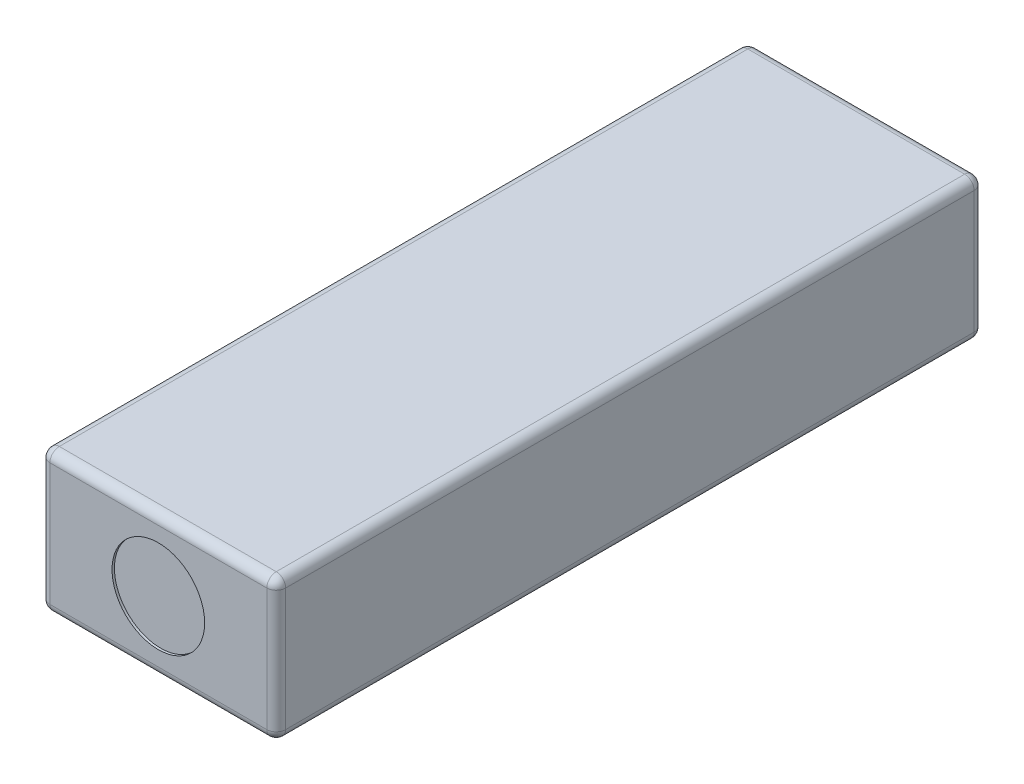
ISO-10303-21;
HEADER;
FILE_DESCRIPTION(('STEP AP214'),'2;1');
FILE_NAME('part.step','',(''),(''),'','','');
FILE_SCHEMA(('AUTOMOTIVE_DESIGN { 1 0 10303 214 1 1 1 1 }'));
ENDSEC;
DATA;
#1=APPLICATION_CONTEXT('core data for automotive mechanical design processes');
#2=APPLICATION_PROTOCOL_DEFINITION('international standard','automotive_design',2000,#1);
#3=PRODUCT_CONTEXT('',#1,'mechanical');
#4=PRODUCT('Part','Part','',(#3));
#5=PRODUCT_RELATED_PRODUCT_CATEGORY('part','',(#4));
#6=PRODUCT_DEFINITION_FORMATION('','',#4);
#7=PRODUCT_DEFINITION_CONTEXT('part definition',#1,'design');
#8=PRODUCT_DEFINITION('design','',#6,#7);
#9=PRODUCT_DEFINITION_SHAPE('','',#8);
#10=(LENGTH_UNIT() NAMED_UNIT(*) SI_UNIT(.MILLI.,.METRE.));
#11=(NAMED_UNIT(*) PLANE_ANGLE_UNIT() SI_UNIT($,.RADIAN.));
#12=(NAMED_UNIT(*) SI_UNIT($,.STERADIAN.) SOLID_ANGLE_UNIT());
#13=UNCERTAINTY_MEASURE_WITH_UNIT(LENGTH_MEASURE(1.E-05),#10,'distance_accuracy_value','');
#14=(GEOMETRIC_REPRESENTATION_CONTEXT(3) GLOBAL_UNCERTAINTY_ASSIGNED_CONTEXT((#13)) GLOBAL_UNIT_ASSIGNED_CONTEXT((#10,
#11,#12)) REPRESENTATION_CONTEXT('',''));
#15=CARTESIAN_POINT('',(0.,0.,0.));
#16=DIRECTION('',(0.,0.,1.));
#17=DIRECTION('',(1.,0.,0.));
#18=AXIS2_PLACEMENT_3D('',#15,#16,#17);
#19=CARTESIAN_POINT('',(25.,30.,-75.));
#20=DIRECTION('',(-1.,0.,0.));
#21=DIRECTION('',(0.,0.,1.));
#22=AXIS2_PLACEMENT_3D('',#19,#20,#21);
#23=PLANE('',#22);
#24=DIRECTION('',(0.,-1.,0.));
#25=VECTOR('',#24,1.);
#26=CARTESIAN_POINT('',(25.,30.,73.));
#27=LINE('',#26,#25);
#28=CARTESIAN_POINT('',(25.,28.,73.));
#29=VERTEX_POINT('',#28);
#30=CARTESIAN_POINT('',(25.,2.,73.));
#31=VERTEX_POINT('',#30);
#32=EDGE_CURVE('E141',#29,#31,#27,.T.);
#33=ORIENTED_EDGE('',*,*,#32,.T.);
#34=DIRECTION('',(0.,0.,-1.));
#35=VECTOR('',#34,1.);
#36=CARTESIAN_POINT('',(25.,2.,-75.));
#37=LINE('',#36,#35);
#38=CARTESIAN_POINT('',(25.,2.,-73.));
#39=VERTEX_POINT('',#38);
#40=EDGE_CURVE('E136',#31,#39,#37,.T.);
#41=ORIENTED_EDGE('',*,*,#40,.T.);
#42=DIRECTION('',(0.,-1.,0.));
#43=VECTOR('',#42,1.);
#44=CARTESIAN_POINT('',(25.,30.,-73.));
#45=LINE('',#44,#43);
#46=CARTESIAN_POINT('',(25.,28.,-73.));
#47=VERTEX_POINT('',#46);
#48=EDGE_CURVE('E131',#39,#47,#45,.F.);
#49=ORIENTED_EDGE('',*,*,#48,.T.);
#50=DIRECTION('',(0.,0.,-1.));
#51=VECTOR('',#50,1.);
#52=CARTESIAN_POINT('',(25.,28.,75.));
#53=LINE('',#52,#51);
#54=EDGE_CURVE('E133',#47,#29,#53,.F.);
#55=ORIENTED_EDGE('',*,*,#54,.T.);
#56=EDGE_LOOP('',(#33,#41,#49,#55));
#57=FACE_BOUND('',#56,.T.);
#58=ADVANCED_FACE('F42',(#57),#23,.F.);
#59=CARTESIAN_POINT('',(-25.,30.,-75.));
#60=DIRECTION('',(0.,0.,1.));
#61=DIRECTION('',(1.,0.,0.));
#62=AXIS2_PLACEMENT_3D('',#59,#60,#61);
#63=PLANE('',#62);
#64=DIRECTION('',(-1.,0.,0.));
#65=VECTOR('',#64,1.);
#66=CARTESIAN_POINT('',(25.,28.,-75.));
#67=LINE('',#66,#65);
#68=CARTESIAN_POINT('',(-23.,28.,-75.));
#69=VERTEX_POINT('',#68);
#70=CARTESIAN_POINT('',(23.,28.,-75.));
#71=VERTEX_POINT('',#70);
#72=EDGE_CURVE('E266',#69,#71,#67,.F.);
#73=ORIENTED_EDGE('',*,*,#72,.T.);
#74=DIRECTION('',(0.,-1.,0.));
#75=VECTOR('',#74,1.);
#76=CARTESIAN_POINT('',(23.,30.,-75.));
#77=LINE('',#76,#75);
#78=CARTESIAN_POINT('',(23.,2.,-75.));
#79=VERTEX_POINT('',#78);
#80=EDGE_CURVE('E165',#71,#79,#77,.T.);
#81=ORIENTED_EDGE('',*,*,#80,.T.);
#82=DIRECTION('',(-1.,0.,0.));
#83=VECTOR('',#82,1.);
#84=CARTESIAN_POINT('',(-25.,2.,-75.));
#85=LINE('',#84,#83);
#86=CARTESIAN_POINT('',(-23.,2.,-75.));
#87=VERTEX_POINT('',#86);
#88=EDGE_CURVE('E269',#79,#87,#85,.T.);
#89=ORIENTED_EDGE('',*,*,#88,.T.);
#90=DIRECTION('',(0.,-1.,0.));
#91=VECTOR('',#90,1.);
#92=CARTESIAN_POINT('',(-23.,30.,-75.));
#93=LINE('',#92,#91);
#94=EDGE_CURVE('E263',#87,#69,#93,.F.);
#95=ORIENTED_EDGE('',*,*,#94,.T.);
#96=EDGE_LOOP('',(#73,#81,#89,#95));
#97=FACE_BOUND('',#96,.T.);
#98=ADVANCED_FACE('F341',(#97),#63,.F.);
#99=CARTESIAN_POINT('',(-25.,30.,-75.));
#100=DIRECTION('',(1.,0.,0.));
#101=DIRECTION('',(0.,0.,-1.));
#102=AXIS2_PLACEMENT_3D('',#99,#100,#101);
#103=PLANE('',#102);
#104=DIRECTION('',(0.,0.,1.));
#105=VECTOR('',#104,1.);
#106=CARTESIAN_POINT('',(-25.,28.,-75.));
#107=LINE('',#106,#105);
#108=CARTESIAN_POINT('',(-25.,28.,73.));
#109=VERTEX_POINT('',#108);
#110=CARTESIAN_POINT('',(-25.,28.,-73.));
#111=VERTEX_POINT('',#110);
#112=EDGE_CURVE('E52',#109,#111,#107,.F.);
#113=ORIENTED_EDGE('',*,*,#112,.T.);
#114=DIRECTION('',(0.,-1.,0.));
#115=VECTOR('',#114,1.);
#116=CARTESIAN_POINT('',(-25.,30.,-73.));
#117=LINE('',#116,#115);
#118=CARTESIAN_POINT('',(-25.,2.,-73.));
#119=VERTEX_POINT('',#118);
#120=EDGE_CURVE('E11',#111,#119,#117,.T.);
#121=ORIENTED_EDGE('',*,*,#120,.T.);
#122=DIRECTION('',(0.,0.,1.));
#123=VECTOR('',#122,1.);
#124=CARTESIAN_POINT('',(-25.,2.,-75.));
#125=LINE('',#124,#123);
#126=CARTESIAN_POINT('',(-25.,2.,73.));
#127=VERTEX_POINT('',#126);
#128=EDGE_CURVE('E287',#119,#127,#125,.T.);
#129=ORIENTED_EDGE('',*,*,#128,.T.);
#130=DIRECTION('',(0.,-1.,0.));
#131=VECTOR('',#130,1.);
#132=CARTESIAN_POINT('',(-25.,30.,73.));
#133=LINE('',#132,#131);
#134=EDGE_CURVE('E63',#127,#109,#133,.F.);
#135=ORIENTED_EDGE('',*,*,#134,.T.);
#136=EDGE_LOOP('',(#113,#121,#129,#135));
#137=FACE_BOUND('',#136,.T.);
#138=ADVANCED_FACE('F354',(#137),#103,.F.);
#139=CARTESIAN_POINT('',(-25.,30.,75.));
#140=DIRECTION('',(0.,0.,-1.));
#141=DIRECTION('',(-1.,0.,0.));
#142=AXIS2_PLACEMENT_3D('',#139,#140,#141);
#143=PLANE('',#142);
#144=CARTESIAN_POINT('',(0.,15.,75.));
#145=DIRECTION('',(0.,0.,1.));
#146=DIRECTION('',(1.,0.,0.));
#147=AXIS2_PLACEMENT_3D('',#144,#145,#146);
#148=CIRCLE('',#147,9.81775282042909);
#149=CARTESIAN_POINT('',(9.8177528204291,15.,75.));
#150=VERTEX_POINT('',#149);
#151=EDGE_CURVE('E659',#150,#150,#148,.T.);
#152=ORIENTED_EDGE('',*,*,#151,.F.);
#153=EDGE_LOOP('',(#152));
#154=FACE_BOUND('',#153,.T.);
#155=DIRECTION('',(1.,0.,0.));
#156=VECTOR('',#155,1.);
#157=CARTESIAN_POINT('',(-25.,2.,75.));
#158=LINE('',#157,#156);
#159=CARTESIAN_POINT('',(-23.,2.,75.));
#160=VERTEX_POINT('',#159);
#161=CARTESIAN_POINT('',(23.,2.,75.));
#162=VERTEX_POINT('',#161);
#163=EDGE_CURVE('E250',#160,#162,#158,.T.);
#164=ORIENTED_EDGE('',*,*,#163,.T.);
#165=DIRECTION('',(0.,-1.,0.));
#166=VECTOR('',#165,1.);
#167=CARTESIAN_POINT('',(23.,30.,75.));
#168=LINE('',#167,#166);
#169=CARTESIAN_POINT('',(23.,28.,75.));
#170=VERTEX_POINT('',#169);
#171=EDGE_CURVE('E259',#162,#170,#168,.F.);
#172=ORIENTED_EDGE('',*,*,#171,.T.);
#173=DIRECTION('',(1.,0.,0.));
#174=VECTOR('',#173,1.);
#175=CARTESIAN_POINT('',(-25.,28.,75.));
#176=LINE('',#175,#174);
#177=CARTESIAN_POINT('',(-23.,28.,75.));
#178=VERTEX_POINT('',#177);
#179=EDGE_CURVE('E245',#170,#178,#176,.F.);
#180=ORIENTED_EDGE('',*,*,#179,.T.);
#181=DIRECTION('',(0.,-1.,0.));
#182=VECTOR('',#181,1.);
#183=CARTESIAN_POINT('',(-23.,30.,75.));
#184=LINE('',#183,#182);
#185=EDGE_CURVE('E241',#178,#160,#184,.T.);
#186=ORIENTED_EDGE('',*,*,#185,.T.);
#187=EDGE_LOOP('',(#164,#172,#180,#186));
#188=FACE_BOUND('',#187,.T.);
#189=ADVANCED_FACE('F362',(#154,#188),#143,.F.);
#190=CARTESIAN_POINT('',(0.,30.,0.));
#191=DIRECTION('',(0.,1.,0.));
#192=DIRECTION('',(0.,0.,1.));
#193=AXIS2_PLACEMENT_3D('',#190,#191,#192);
#194=PLANE('',#193);
#195=DIRECTION('',(1.,0.,0.));
#196=VECTOR('',#195,1.);
#197=CARTESIAN_POINT('',(25.,30.,73.));
#198=LINE('',#197,#196);
#199=CARTESIAN_POINT('',(-23.,30.,73.));
#200=VERTEX_POINT('',#199);
#201=CARTESIAN_POINT('',(23.,30.,73.));
#202=VERTEX_POINT('',#201);
#203=EDGE_CURVE('E280',#200,#202,#198,.T.);
#204=ORIENTED_EDGE('',*,*,#203,.T.);
#205=DIRECTION('',(0.,0.,-1.));
#206=VECTOR('',#205,1.);
#207=CARTESIAN_POINT('',(23.,30.,-75.));
#208=LINE('',#207,#206);
#209=CARTESIAN_POINT('',(23.,30.,-73.));
#210=VERTEX_POINT('',#209);
#211=EDGE_CURVE('E284',#202,#210,#208,.T.);
#212=ORIENTED_EDGE('',*,*,#211,.T.);
#213=DIRECTION('',(-1.,0.,0.));
#214=VECTOR('',#213,1.);
#215=CARTESIAN_POINT('',(-25.,30.,-73.));
#216=LINE('',#215,#214);
#217=CARTESIAN_POINT('',(-23.,30.,-73.));
#218=VERTEX_POINT('',#217);
#219=EDGE_CURVE('E277',#210,#218,#216,.T.);
#220=ORIENTED_EDGE('',*,*,#219,.T.);
#221=DIRECTION('',(0.,0.,1.));
#222=VECTOR('',#221,1.);
#223=CARTESIAN_POINT('',(-23.,30.,75.));
#224=LINE('',#223,#222);
#225=EDGE_CURVE('E274',#218,#200,#224,.T.);
#226=ORIENTED_EDGE('',*,*,#225,.T.);
#227=EDGE_LOOP('',(#204,#212,#220,#226));
#228=FACE_BOUND('',#227,.T.);
#229=ADVANCED_FACE('F347',(#228),#194,.T.);
#230=CARTESIAN_POINT('',(0.,0.,0.));
#231=DIRECTION('',(0.,1.,0.));
#232=DIRECTION('',(0.,0.,1.));
#233=AXIS2_PLACEMENT_3D('',#230,#231,#232);
#234=PLANE('',#233);
#235=DIRECTION('',(-1.,0.,0.));
#236=VECTOR('',#235,1.);
#237=CARTESIAN_POINT('',(0.,0.,-73.));
#238=LINE('',#237,#236);
#239=CARTESIAN_POINT('',(-23.,0.,-73.));
#240=VERTEX_POINT('',#239);
#241=CARTESIAN_POINT('',(23.,0.,-73.));
#242=VERTEX_POINT('',#241);
#243=EDGE_CURVE('E325',#240,#242,#238,.F.);
#244=ORIENTED_EDGE('',*,*,#243,.T.);
#245=DIRECTION('',(0.,0.,-1.));
#246=VECTOR('',#245,1.);
#247=CARTESIAN_POINT('',(23.,0.,0.));
#248=LINE('',#247,#246);
#249=CARTESIAN_POINT('',(23.,0.,73.));
#250=VERTEX_POINT('',#249);
#251=EDGE_CURVE('E246',#242,#250,#248,.F.);
#252=ORIENTED_EDGE('',*,*,#251,.T.);
#253=DIRECTION('',(1.,0.,0.));
#254=VECTOR('',#253,1.);
#255=CARTESIAN_POINT('',(0.,0.,73.));
#256=LINE('',#255,#254);
#257=CARTESIAN_POINT('',(-23.,0.,73.));
#258=VERTEX_POINT('',#257);
#259=EDGE_CURVE('E253',#250,#258,#256,.F.);
#260=ORIENTED_EDGE('',*,*,#259,.T.);
#261=DIRECTION('',(0.,0.,1.));
#262=VECTOR('',#261,1.);
#263=CARTESIAN_POINT('',(-23.,0.,0.));
#264=LINE('',#263,#262);
#265=EDGE_CURVE('E358',#258,#240,#264,.F.);
#266=ORIENTED_EDGE('',*,*,#265,.T.);
#267=EDGE_LOOP('',(#244,#252,#260,#266));
#268=FACE_BOUND('',#267,.T.);
#269=ADVANCED_FACE('F327',(#268),#234,.F.);
#270=CARTESIAN_POINT('',(-23.,28.,0.));
#271=DIRECTION('',(0.,0.,-1.));
#272=DIRECTION('',(-1.,0.,0.));
#273=AXIS2_PLACEMENT_3D('',#270,#271,#272);
#274=CYLINDRICAL_SURFACE('',#273,2.);
#275=CARTESIAN_POINT('',(-23.,28.,73.));
#276=DIRECTION('',(0.,0.,1.));
#277=DIRECTION('',(1.,0.,0.));
#278=AXIS2_PLACEMENT_3D('',#275,#276,#277);
#279=CIRCLE('',#278,2.);
#280=EDGE_CURVE('E46',#200,#109,#279,.T.);
#281=ORIENTED_EDGE('',*,*,#280,.F.);
#282=ORIENTED_EDGE('',*,*,#225,.F.);
#283=CARTESIAN_POINT('',(-23.,28.,-73.));
#284=DIRECTION('',(0.,0.,-1.));
#285=DIRECTION('',(-1.,0.,0.));
#286=AXIS2_PLACEMENT_3D('',#283,#284,#285);
#287=CIRCLE('',#286,2.);
#288=EDGE_CURVE('E220',#111,#218,#287,.T.);
#289=ORIENTED_EDGE('',*,*,#288,.F.);
#290=ORIENTED_EDGE('',*,*,#112,.F.);
#291=EDGE_LOOP('',(#281,#282,#289,#290));
#292=FACE_BOUND('',#291,.T.);
#293=ADVANCED_FACE('F44',(#292),#274,.T.);
#294=CARTESIAN_POINT('',(-23.,28.,73.));
#295=DIRECTION('',(-1.,0.,0.));
#296=DIRECTION('',(0.,0.,1.));
#297=AXIS2_PLACEMENT_3D('',#294,#295,#296);
#298=SPHERICAL_SURFACE('',#297,2.);
#299=CARTESIAN_POINT('',(-23.,28.,73.));
#300=DIRECTION('',(-1.,0.,0.));
#301=DIRECTION('',(0.,0.,1.));
#302=AXIS2_PLACEMENT_3D('',#299,#300,#301);
#303=CIRCLE('',#302,2.);
#304=EDGE_CURVE('E213',#200,#178,#303,.F.);
#305=ORIENTED_EDGE('',*,*,#304,.F.);
#306=ORIENTED_EDGE('',*,*,#280,.T.);
#307=CARTESIAN_POINT('',(-23.,28.,73.));
#308=DIRECTION('',(0.,1.,0.));
#309=DIRECTION('',(0.,0.,1.));
#310=AXIS2_PLACEMENT_3D('',#307,#308,#309);
#311=CIRCLE('',#310,2.);
#312=EDGE_CURVE('E217',#178,#109,#311,.F.);
#313=ORIENTED_EDGE('',*,*,#312,.F.);
#314=EDGE_LOOP('',(#305,#306,#313));
#315=FACE_BOUND('',#314,.T.);
#316=ADVANCED_FACE('F232',(#315),#298,.T.);
#317=CARTESIAN_POINT('',(-23.,28.,-73.));
#318=DIRECTION('',(0.,1.,0.));
#319=DIRECTION('',(0.,0.,1.));
#320=AXIS2_PLACEMENT_3D('',#317,#318,#319);
#321=SPHERICAL_SURFACE('',#320,2.);
#322=CARTESIAN_POINT('',(-23.,28.,-73.));
#323=DIRECTION('',(0.,1.,0.));
#324=DIRECTION('',(0.,0.,1.));
#325=AXIS2_PLACEMENT_3D('',#322,#323,#324);
#326=CIRCLE('',#325,2.);
#327=EDGE_CURVE('E205',#111,#69,#326,.F.);
#328=ORIENTED_EDGE('',*,*,#327,.F.);
#329=ORIENTED_EDGE('',*,*,#288,.T.);
#330=CARTESIAN_POINT('',(-23.,28.,-73.));
#331=DIRECTION('',(-1.,0.,0.));
#332=DIRECTION('',(0.,0.,1.));
#333=AXIS2_PLACEMENT_3D('',#330,#331,#332);
#334=CIRCLE('',#333,2.);
#335=EDGE_CURVE('E209',#69,#218,#334,.F.);
#336=ORIENTED_EDGE('',*,*,#335,.F.);
#337=EDGE_LOOP('',(#328,#329,#336));
#338=FACE_BOUND('',#337,.T.);
#339=ADVANCED_FACE('F349',(#338),#321,.T.);
#340=CARTESIAN_POINT('',(-23.,30.,73.));
#341=DIRECTION('',(0.,-1.,0.));
#342=DIRECTION('',(0.,0.,-1.));
#343=AXIS2_PLACEMENT_3D('',#340,#341,#342);
#344=CYLINDRICAL_SURFACE('',#343,2.);
#345=ORIENTED_EDGE('',*,*,#312,.T.);
#346=ORIENTED_EDGE('',*,*,#134,.F.);
#347=CARTESIAN_POINT('',(-23.,2.,73.));
#348=DIRECTION('',(0.,-1.,0.));
#349=DIRECTION('',(0.,0.,-1.));
#350=AXIS2_PLACEMENT_3D('',#347,#348,#349);
#351=CIRCLE('',#350,2.);
#352=EDGE_CURVE('E197',#160,#127,#351,.T.);
#353=ORIENTED_EDGE('',*,*,#352,.F.);
#354=ORIENTED_EDGE('',*,*,#185,.F.);
#355=EDGE_LOOP('',(#345,#346,#353,#354));
#356=FACE_BOUND('',#355,.T.);
#357=ADVANCED_FACE('F238',(#356),#344,.T.);
#358=CARTESIAN_POINT('',(0.,28.,73.));
#359=DIRECTION('',(-1.,0.,0.));
#360=DIRECTION('',(0.,0.,1.));
#361=AXIS2_PLACEMENT_3D('',#358,#359,#360);
#362=CYLINDRICAL_SURFACE('',#361,2.);
#363=ORIENTED_EDGE('',*,*,#304,.T.);
#364=ORIENTED_EDGE('',*,*,#179,.F.);
#365=CARTESIAN_POINT('',(23.,28.,73.));
#366=DIRECTION('',(1.,0.,0.));
#367=DIRECTION('',(0.,0.,-1.));
#368=AXIS2_PLACEMENT_3D('',#365,#366,#367);
#369=CIRCLE('',#368,2.);
#370=EDGE_CURVE('E193',#202,#170,#369,.T.);
#371=ORIENTED_EDGE('',*,*,#370,.F.);
#372=ORIENTED_EDGE('',*,*,#203,.F.);
#373=EDGE_LOOP('',(#363,#364,#371,#372));
#374=FACE_BOUND('',#373,.T.);
#375=ADVANCED_FACE('F371',(#374),#362,.T.);
#376=CARTESIAN_POINT('',(23.,28.,0.));
#377=DIRECTION('',(0.,0.,1.));
#378=DIRECTION('',(1.,0.,0.));
#379=AXIS2_PLACEMENT_3D('',#376,#377,#378);
#380=CYLINDRICAL_SURFACE('',#379,2.);
#381=CARTESIAN_POINT('',(23.,28.,-73.));
#382=DIRECTION('',(0.,0.,-1.));
#383=DIRECTION('',(-1.,0.,0.));
#384=AXIS2_PLACEMENT_3D('',#381,#382,#383);
#385=CIRCLE('',#384,2.);
#386=EDGE_CURVE('E148',#210,#47,#385,.T.);
#387=ORIENTED_EDGE('',*,*,#386,.F.);
#388=ORIENTED_EDGE('',*,*,#211,.F.);
#389=CARTESIAN_POINT('',(23.,28.,73.));
#390=DIRECTION('',(0.,0.,1.));
#391=DIRECTION('',(1.,0.,0.));
#392=AXIS2_PLACEMENT_3D('',#389,#390,#391);
#393=CIRCLE('',#392,2.);
#394=EDGE_CURVE('E150',#29,#202,#393,.T.);
#395=ORIENTED_EDGE('',*,*,#394,.F.);
#396=ORIENTED_EDGE('',*,*,#54,.F.);
#397=EDGE_LOOP('',(#387,#388,#395,#396));
#398=FACE_BOUND('',#397,.T.);
#399=ADVANCED_FACE('F146',(#398),#380,.T.);
#400=CARTESIAN_POINT('',(0.,28.,-73.));
#401=DIRECTION('',(1.,0.,0.));
#402=DIRECTION('',(0.,0.,-1.));
#403=AXIS2_PLACEMENT_3D('',#400,#401,#402);
#404=CYLINDRICAL_SURFACE('',#403,2.);
#405=ORIENTED_EDGE('',*,*,#335,.T.);
#406=ORIENTED_EDGE('',*,*,#219,.F.);
#407=CARTESIAN_POINT('',(23.,28.,-73.));
#408=DIRECTION('',(1.,0.,0.));
#409=DIRECTION('',(0.,0.,-1.));
#410=AXIS2_PLACEMENT_3D('',#407,#408,#409);
#411=CIRCLE('',#410,2.);
#412=EDGE_CURVE('E160',#71,#210,#411,.T.);
#413=ORIENTED_EDGE('',*,*,#412,.F.);
#414=ORIENTED_EDGE('',*,*,#72,.F.);
#415=EDGE_LOOP('',(#405,#406,#413,#414));
#416=FACE_BOUND('',#415,.T.);
#417=ADVANCED_FACE('F345',(#416),#404,.T.);
#418=CARTESIAN_POINT('',(-23.,30.,-73.));
#419=DIRECTION('',(0.,-1.,0.));
#420=DIRECTION('',(0.,0.,-1.));
#421=AXIS2_PLACEMENT_3D('',#418,#419,#420);
#422=CYLINDRICAL_SURFACE('',#421,2.);
#423=ORIENTED_EDGE('',*,*,#327,.T.);
#424=ORIENTED_EDGE('',*,*,#94,.F.);
#425=CARTESIAN_POINT('',(-23.,2.,-73.));
#426=DIRECTION('',(0.,-1.,0.));
#427=DIRECTION('',(0.,0.,-1.));
#428=AXIS2_PLACEMENT_3D('',#425,#426,#427);
#429=CIRCLE('',#428,2.);
#430=EDGE_CURVE('E185',#119,#87,#429,.T.);
#431=ORIENTED_EDGE('',*,*,#430,.F.);
#432=ORIENTED_EDGE('',*,*,#120,.F.);
#433=EDGE_LOOP('',(#423,#424,#431,#432));
#434=FACE_BOUND('',#433,.T.);
#435=ADVANCED_FACE('F352',(#434),#422,.T.);
#436=CARTESIAN_POINT('',(-23.,2.,-75.));
#437=DIRECTION('',(0.,0.,1.));
#438=DIRECTION('',(1.,0.,0.));
#439=AXIS2_PLACEMENT_3D('',#436,#437,#438);
#440=CYLINDRICAL_SURFACE('',#439,2.);
#441=CARTESIAN_POINT('',(-23.,2.,73.));
#442=DIRECTION('',(0.,0.,1.));
#443=DIRECTION('',(1.,0.,0.));
#444=AXIS2_PLACEMENT_3D('',#441,#442,#443);
#445=CIRCLE('',#444,2.);
#446=EDGE_CURVE('E201',#127,#258,#445,.T.);
#447=ORIENTED_EDGE('',*,*,#446,.F.);
#448=ORIENTED_EDGE('',*,*,#128,.F.);
#449=CARTESIAN_POINT('',(-23.,2.,-73.));
#450=DIRECTION('',(0.,0.,-1.));
#451=DIRECTION('',(-1.,0.,0.));
#452=AXIS2_PLACEMENT_3D('',#449,#450,#451);
#453=CIRCLE('',#452,2.);
#454=EDGE_CURVE('E182',#240,#119,#453,.T.);
#455=ORIENTED_EDGE('',*,*,#454,.F.);
#456=ORIENTED_EDGE('',*,*,#265,.F.);
#457=EDGE_LOOP('',(#447,#448,#455,#456));
#458=FACE_BOUND('',#457,.T.);
#459=ADVANCED_FACE('F357',(#458),#440,.T.);
#460=CARTESIAN_POINT('',(-23.,2.,73.));
#461=DIRECTION('',(-1.,0.,0.));
#462=DIRECTION('',(0.,-1.,0.));
#463=AXIS2_PLACEMENT_3D('',#460,#461,#462);
#464=SPHERICAL_SURFACE('',#463,2.);
#465=ORIENTED_EDGE('',*,*,#352,.T.);
#466=ORIENTED_EDGE('',*,*,#446,.T.);
#467=CARTESIAN_POINT('',(-23.,2.,73.));
#468=DIRECTION('',(-1.,0.,0.));
#469=DIRECTION('',(0.,0.,1.));
#470=AXIS2_PLACEMENT_3D('',#467,#468,#469);
#471=CIRCLE('',#470,2.);
#472=EDGE_CURVE('E172',#160,#258,#471,.F.);
#473=ORIENTED_EDGE('',*,*,#472,.F.);
#474=EDGE_LOOP('',(#465,#466,#473));
#475=FACE_BOUND('',#474,.T.);
#476=ADVANCED_FACE('F360',(#475),#464,.T.);
#477=CARTESIAN_POINT('',(23.,28.,73.));
#478=DIRECTION('',(0.,1.,0.));
#479=DIRECTION('',(0.,0.,1.));
#480=AXIS2_PLACEMENT_3D('',#477,#478,#479);
#481=SPHERICAL_SURFACE('',#480,2.);
#482=ORIENTED_EDGE('',*,*,#394,.T.);
#483=ORIENTED_EDGE('',*,*,#370,.T.);
#484=CARTESIAN_POINT('',(23.,28.,73.));
#485=DIRECTION('',(0.,1.,0.));
#486=DIRECTION('',(0.,0.,1.));
#487=AXIS2_PLACEMENT_3D('',#484,#485,#486);
#488=CIRCLE('',#487,2.);
#489=EDGE_CURVE('E167',#29,#170,#488,.F.);
#490=ORIENTED_EDGE('',*,*,#489,.F.);
#491=EDGE_LOOP('',(#482,#483,#490));
#492=FACE_BOUND('',#491,.T.);
#493=ADVANCED_FACE('F369',(#492),#481,.T.);
#494=CARTESIAN_POINT('',(23.,28.,-73.));
#495=DIRECTION('',(0.,1.,0.));
#496=DIRECTION('',(0.,0.,1.));
#497=AXIS2_PLACEMENT_3D('',#494,#495,#496);
#498=SPHERICAL_SURFACE('',#497,2.);
#499=ORIENTED_EDGE('',*,*,#412,.T.);
#500=ORIENTED_EDGE('',*,*,#386,.T.);
#501=CARTESIAN_POINT('',(23.,28.,-73.));
#502=DIRECTION('',(0.,1.,0.));
#503=DIRECTION('',(0.,0.,1.));
#504=AXIS2_PLACEMENT_3D('',#501,#502,#503);
#505=CIRCLE('',#504,2.);
#506=EDGE_CURVE('E157',#71,#47,#505,.F.);
#507=ORIENTED_EDGE('',*,*,#506,.F.);
#508=EDGE_LOOP('',(#499,#500,#507));
#509=FACE_BOUND('',#508,.T.);
#510=ADVANCED_FACE('F156',(#509),#498,.T.);
#511=CARTESIAN_POINT('',(-23.,2.,-73.));
#512=DIRECTION('',(-1.,0.,0.));
#513=DIRECTION('',(0.,-1.,0.));
#514=AXIS2_PLACEMENT_3D('',#511,#512,#513);
#515=SPHERICAL_SURFACE('',#514,2.);
#516=ORIENTED_EDGE('',*,*,#454,.T.);
#517=ORIENTED_EDGE('',*,*,#430,.T.);
#518=CARTESIAN_POINT('',(-23.,2.,-73.));
#519=DIRECTION('',(-1.,0.,0.));
#520=DIRECTION('',(0.,0.,1.));
#521=AXIS2_PLACEMENT_3D('',#518,#519,#520);
#522=CIRCLE('',#521,2.);
#523=EDGE_CURVE('E168',#240,#87,#522,.F.);
#524=ORIENTED_EDGE('',*,*,#523,.F.);
#525=EDGE_LOOP('',(#516,#517,#524));
#526=FACE_BOUND('',#525,.T.);
#527=ADVANCED_FACE('F403',(#526),#515,.T.);
#528=CARTESIAN_POINT('',(-25.,2.,73.));
#529=DIRECTION('',(1.,0.,0.));
#530=DIRECTION('',(0.,0.,-1.));
#531=AXIS2_PLACEMENT_3D('',#528,#529,#530);
#532=CYLINDRICAL_SURFACE('',#531,2.);
#533=ORIENTED_EDGE('',*,*,#472,.T.);
#534=ORIENTED_EDGE('',*,*,#259,.F.);
#535=CARTESIAN_POINT('',(23.,2.,73.));
#536=DIRECTION('',(1.,0.,0.));
#537=DIRECTION('',(0.,0.,-1.));
#538=AXIS2_PLACEMENT_3D('',#535,#536,#537);
#539=CIRCLE('',#538,2.);
#540=EDGE_CURVE('E175',#162,#250,#539,.T.);
#541=ORIENTED_EDGE('',*,*,#540,.F.);
#542=ORIENTED_EDGE('',*,*,#163,.F.);
#543=EDGE_LOOP('',(#533,#534,#541,#542));
#544=FACE_BOUND('',#543,.T.);
#545=ADVANCED_FACE('F321',(#544),#532,.T.);
#546=CARTESIAN_POINT('',(23.,30.,73.));
#547=DIRECTION('',(0.,-1.,0.));
#548=DIRECTION('',(0.,0.,-1.));
#549=AXIS2_PLACEMENT_3D('',#546,#547,#548);
#550=CYLINDRICAL_SURFACE('',#549,2.);
#551=ORIENTED_EDGE('',*,*,#489,.T.);
#552=ORIENTED_EDGE('',*,*,#171,.F.);
#553=CARTESIAN_POINT('',(23.,2.,73.));
#554=DIRECTION('',(0.,-1.,0.));
#555=DIRECTION('',(0.,0.,-1.));
#556=AXIS2_PLACEMENT_3D('',#553,#554,#555);
#557=CIRCLE('',#556,2.);
#558=EDGE_CURVE('E308',#31,#162,#557,.T.);
#559=ORIENTED_EDGE('',*,*,#558,.F.);
#560=ORIENTED_EDGE('',*,*,#32,.F.);
#561=EDGE_LOOP('',(#551,#552,#559,#560));
#562=FACE_BOUND('',#561,.T.);
#563=ADVANCED_FACE('F364',(#562),#550,.T.);
#564=CARTESIAN_POINT('',(23.,30.,-73.));
#565=DIRECTION('',(0.,-1.,0.));
#566=DIRECTION('',(0.,0.,-1.));
#567=AXIS2_PLACEMENT_3D('',#564,#565,#566);
#568=CYLINDRICAL_SURFACE('',#567,2.);
#569=ORIENTED_EDGE('',*,*,#506,.T.);
#570=ORIENTED_EDGE('',*,*,#48,.F.);
#571=CARTESIAN_POINT('',(23.,2.,-73.));
#572=DIRECTION('',(0.,-1.,0.));
#573=DIRECTION('',(0.,0.,-1.));
#574=AXIS2_PLACEMENT_3D('',#571,#572,#573);
#575=CIRCLE('',#574,2.);
#576=EDGE_CURVE('E304',#79,#39,#575,.T.);
#577=ORIENTED_EDGE('',*,*,#576,.F.);
#578=ORIENTED_EDGE('',*,*,#80,.F.);
#579=EDGE_LOOP('',(#569,#570,#577,#578));
#580=FACE_BOUND('',#579,.T.);
#581=ADVANCED_FACE('F163',(#580),#568,.T.);
#582=CARTESIAN_POINT('',(-25.,2.,-73.));
#583=DIRECTION('',(-1.,0.,0.));
#584=DIRECTION('',(0.,0.,1.));
#585=AXIS2_PLACEMENT_3D('',#582,#583,#584);
#586=CYLINDRICAL_SURFACE('',#585,2.);
#587=ORIENTED_EDGE('',*,*,#523,.T.);
#588=ORIENTED_EDGE('',*,*,#88,.F.);
#589=CARTESIAN_POINT('',(23.,2.,-73.));
#590=DIRECTION('',(1.,0.,0.));
#591=DIRECTION('',(0.,0.,-1.));
#592=AXIS2_PLACEMENT_3D('',#589,#590,#591);
#593=CIRCLE('',#592,2.);
#594=EDGE_CURVE('E301',#242,#79,#593,.T.);
#595=ORIENTED_EDGE('',*,*,#594,.F.);
#596=ORIENTED_EDGE('',*,*,#243,.F.);
#597=EDGE_LOOP('',(#587,#588,#595,#596));
#598=FACE_BOUND('',#597,.T.);
#599=ADVANCED_FACE('F337',(#598),#586,.T.);
#600=CARTESIAN_POINT('',(23.,2.,73.));
#601=DIRECTION('',(0.,0.,1.));
#602=DIRECTION('',(0.,-1.,0.));
#603=AXIS2_PLACEMENT_3D('',#600,#601,#602);
#604=SPHERICAL_SURFACE('',#603,2.);
#605=ORIENTED_EDGE('',*,*,#558,.T.);
#606=ORIENTED_EDGE('',*,*,#540,.T.);
#607=CARTESIAN_POINT('',(23.,2.,73.));
#608=DIRECTION('',(0.,0.,1.));
#609=DIRECTION('',(1.,0.,0.));
#610=AXIS2_PLACEMENT_3D('',#607,#608,#609);
#611=CIRCLE('',#610,2.);
#612=EDGE_CURVE('E297',#31,#250,#611,.F.);
#613=ORIENTED_EDGE('',*,*,#612,.F.);
#614=EDGE_LOOP('',(#605,#606,#613));
#615=FACE_BOUND('',#614,.T.);
#616=ADVANCED_FACE('F317',(#615),#604,.T.);
#617=CARTESIAN_POINT('',(23.,2.,-73.));
#618=DIRECTION('',(0.,0.,-1.));
#619=DIRECTION('',(0.,1.,0.));
#620=AXIS2_PLACEMENT_3D('',#617,#618,#619);
#621=SPHERICAL_SURFACE('',#620,2.);
#622=ORIENTED_EDGE('',*,*,#594,.T.);
#623=ORIENTED_EDGE('',*,*,#576,.T.);
#624=CARTESIAN_POINT('',(23.,2.,-73.));
#625=DIRECTION('',(0.,0.,-1.));
#626=DIRECTION('',(-1.,0.,0.));
#627=AXIS2_PLACEMENT_3D('',#624,#625,#626);
#628=CIRCLE('',#627,2.);
#629=EDGE_CURVE('E294',#242,#39,#628,.F.);
#630=ORIENTED_EDGE('',*,*,#629,.F.);
#631=EDGE_LOOP('',(#622,#623,#630));
#632=FACE_BOUND('',#631,.T.);
#633=ADVANCED_FACE('F334',(#632),#621,.T.);
#634=CARTESIAN_POINT('',(23.,2.,-75.));
#635=DIRECTION('',(0.,0.,-1.));
#636=DIRECTION('',(-1.,0.,0.));
#637=AXIS2_PLACEMENT_3D('',#634,#635,#636);
#638=CYLINDRICAL_SURFACE('',#637,2.);
#639=ORIENTED_EDGE('',*,*,#612,.T.);
#640=ORIENTED_EDGE('',*,*,#251,.F.);
#641=ORIENTED_EDGE('',*,*,#629,.T.);
#642=ORIENTED_EDGE('',*,*,#40,.F.);
#643=EDGE_LOOP('',(#639,#640,#641,#642));
#644=FACE_BOUND('',#643,.T.);
#645=ADVANCED_FACE('F332',(#644),#638,.T.);
#646=CARTESIAN_POINT('',(0.,15.,74.5));
#647=DIRECTION('',(0.,0.,1.));
#648=DIRECTION('',(1.,0.,0.));
#649=AXIS2_PLACEMENT_3D('',#646,#647,#648);
#650=CYLINDRICAL_SURFACE('',#649,9.81775282042909);
#651=CARTESIAN_POINT('',(0.,15.,74.5));
#652=DIRECTION('',(0.,0.,1.));
#653=DIRECTION('',(1.,0.,0.));
#654=AXIS2_PLACEMENT_3D('',#651,#652,#653);
#655=CIRCLE('',#654,9.81775282042909);
#656=CARTESIAN_POINT('',(9.8177528204291,15.,74.5));
#657=VERTEX_POINT('',#656);
#658=EDGE_CURVE('E298',#657,#657,#655,.T.);
#659=ORIENTED_EDGE('',*,*,#658,.F.);
#660=EDGE_LOOP('',(#659));
#661=FACE_BOUND('',#660,.T.);
#662=ORIENTED_EDGE('',*,*,#151,.T.);
#663=EDGE_LOOP('',(#662));
#664=FACE_BOUND('',#663,.T.);
#665=ADVANCED_FACE('F390',(#661,#664),#650,.F.);
#666=CARTESIAN_POINT('',(0.,15.,74.5));
#667=DIRECTION('',(0.,0.,1.));
#668=DIRECTION('',(1.,0.,0.));
#669=AXIS2_PLACEMENT_3D('',#666,#667,#668);
#670=PLANE('',#669);
#671=ORIENTED_EDGE('',*,*,#658,.T.);
#672=EDGE_LOOP('',(#671));
#673=FACE_BOUND('',#672,.T.);
#674=ADVANCED_FACE('F481',(#673),#670,.T.);
#675=CLOSED_SHELL('',(#58,#98,#138,#189,#229,#269,#293,#316,#339,#357,#375,#399,#417,#435,#459,
#476,#493,#510,#527,#545,#563,#581,#599,#616,#633,#645,#665,#674));
#676=MANIFOLD_SOLID_BREP('B2',#675);
#677=ADVANCED_BREP_SHAPE_REPRESENTATION('',(#18,#676),#14);
#678=SHAPE_DEFINITION_REPRESENTATION(#9,#677);
ENDSEC;
END-ISO-10303-21;
